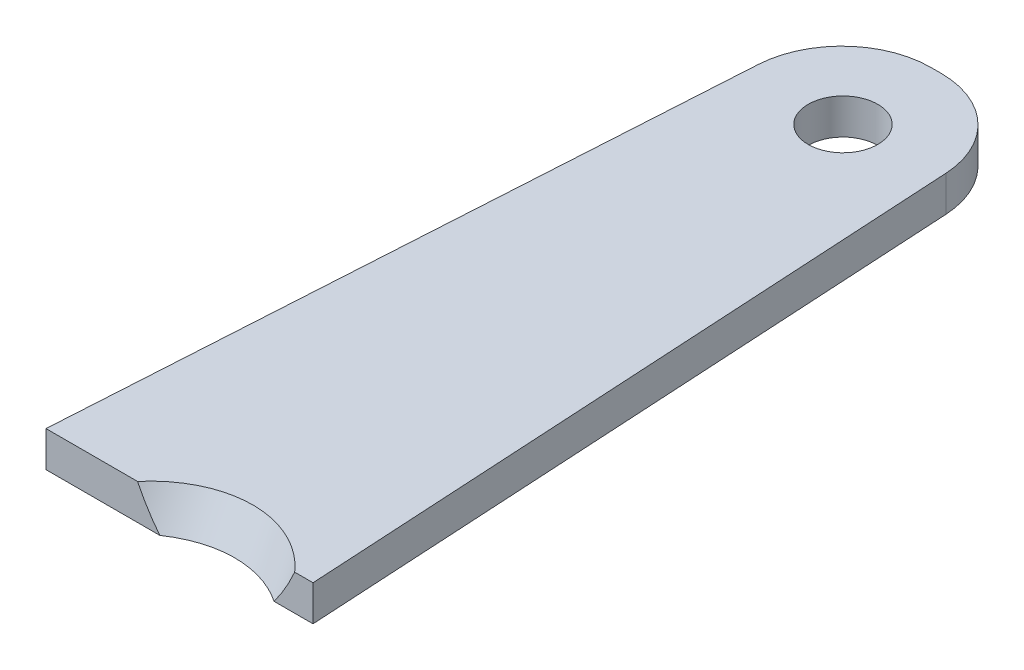
ISO-10303-21;
HEADER;
FILE_DESCRIPTION(('STEP AP214'),'2;1');
FILE_NAME('part.step','',(''),(''),'','','');
FILE_SCHEMA(('AUTOMOTIVE_DESIGN { 1 0 10303 214 1 1 1 1 }'));
ENDSEC;
DATA;
#1=APPLICATION_CONTEXT('core data for automotive mechanical design processes');
#2=APPLICATION_PROTOCOL_DEFINITION('international standard','automotive_design',2000,#1);
#3=PRODUCT_CONTEXT('',#1,'mechanical');
#4=PRODUCT('Part','Part','',(#3));
#5=PRODUCT_RELATED_PRODUCT_CATEGORY('part','',(#4));
#6=PRODUCT_DEFINITION_FORMATION('','',#4);
#7=PRODUCT_DEFINITION_CONTEXT('part definition',#1,'design');
#8=PRODUCT_DEFINITION('design','',#6,#7);
#9=PRODUCT_DEFINITION_SHAPE('','',#8);
#10=(LENGTH_UNIT() NAMED_UNIT(*) SI_UNIT(.MILLI.,.METRE.));
#11=(NAMED_UNIT(*) PLANE_ANGLE_UNIT() SI_UNIT($,.RADIAN.));
#12=(NAMED_UNIT(*) SI_UNIT($,.STERADIAN.) SOLID_ANGLE_UNIT());
#13=UNCERTAINTY_MEASURE_WITH_UNIT(LENGTH_MEASURE(1.E-05),#10,'distance_accuracy_value','');
#14=(GEOMETRIC_REPRESENTATION_CONTEXT(3) GLOBAL_UNCERTAINTY_ASSIGNED_CONTEXT((#13)) GLOBAL_UNIT_ASSIGNED_CONTEXT((#10,
#11,#12)) REPRESENTATION_CONTEXT('',''));
#15=CARTESIAN_POINT('',(0.,0.,0.));
#16=DIRECTION('',(0.,0.,1.));
#17=DIRECTION('',(1.,0.,0.));
#18=AXIS2_PLACEMENT_3D('',#15,#16,#17);
#19=CARTESIAN_POINT('',(15.7255762940305,4.,-74.8434889798303));
#20=DIRECTION('',(0.,-1.,0.));
#21=DIRECTION('',(0.,0.,-1.));
#22=AXIS2_PLACEMENT_3D('',#19,#20,#21);
#23=PLANE('',#22);
#24=CARTESIAN_POINT('',(15.1727945109492,4.,-74.3625495927809));
#25=DIRECTION('',(0.,1.,0.));
#26=DIRECTION('',(0.,0.,1.));
#27=AXIS2_PLACEMENT_3D('',#24,#25,#26);
#28=CIRCLE('',#27,3.91105280336223);
#29=CARTESIAN_POINT('',(15.1727945109492,4.,-70.4514967894187));
#30=VERTEX_POINT('',#29);
#31=EDGE_CURVE('E133',#30,#30,#28,.T.);
#32=ORIENTED_EDGE('',*,*,#31,.F.);
#33=EDGE_LOOP('',(#32));
#34=FACE_BOUND('',#33,.T.);
#35=CARTESIAN_POINT('',(19.2361378723391,4.,9.92641805146242));
#36=DIRECTION('',(0.,-1.,0.));
#37=DIRECTION('',(0.0568035499201906,0.,0.998385374851047));
#38=AXIS2_PLACEMENT_3D('',#35,#36,#37);
#39=ELLIPSE('',#38,14.1222722952671,12.415);
#40=CARTESIAN_POINT('',(27.9389933135625,4.,0.));
#41=VERTEX_POINT('',#40);
#42=CARTESIAN_POINT('',(10.2773268467535,4.,0.));
#43=VERTEX_POINT('',#42);
#44=EDGE_CURVE('E48',#41,#43,#39,.F.);
#45=ORIENTED_EDGE('',*,*,#44,.F.);
#46=DIRECTION('',(1.,0.,0.));
#47=VECTOR('',#46,1.);
#48=CARTESIAN_POINT('',(0.,4.,0.));
#49=LINE('',#48,#47);
#50=CARTESIAN_POINT('',(30.,4.,0.));
#51=VERTEX_POINT('',#50);
#52=EDGE_CURVE('E201',#41,#51,#49,.T.);
#53=ORIENTED_EDGE('',*,*,#52,.T.);
#54=DIRECTION('',(-0.056803549920191,0.,-0.998385374851046));
#55=VECTOR('',#54,1.);
#56=CARTESIAN_POINT('',(25.7094300425409,4.,-75.4115244790321));
#57=LINE('',#56,#55);
#58=CARTESIAN_POINT('',(25.7094300425409,4.,-75.4115244790321));
#59=VERTEX_POINT('',#58);
#60=EDGE_CURVE('E108',#51,#59,#57,.T.);
#61=ORIENTED_EDGE('',*,*,#60,.T.);
#62=CARTESIAN_POINT('',(15.7255762940305,4.,-74.8434889798303));
#63=DIRECTION('',(0.,1.,0.));
#64=DIRECTION('',(0.,0.,-1.));
#65=AXIS2_PLACEMENT_3D('',#62,#63,#64);
#66=CIRCLE('',#65,10.);
#67=CARTESIAN_POINT('',(15.7255762940304,4.,-84.8434889798303));
#68=VERTEX_POINT('',#67);
#69=EDGE_CURVE('E102',#59,#68,#66,.T.);
#70=ORIENTED_EDGE('',*,*,#69,.T.);
#71=DIRECTION('',(-1.,0.,0.));
#72=VECTOR('',#71,1.);
#73=CARTESIAN_POINT('',(15.1727945109492,4.,-84.8434889798303));
#74=LINE('',#73,#72);
#75=CARTESIAN_POINT('',(14.5665722949634,4.,-84.8434889798303));
#76=VERTEX_POINT('',#75);
#77=EDGE_CURVE('E105',#68,#76,#74,.T.);
#78=ORIENTED_EDGE('',*,*,#77,.T.);
#79=CARTESIAN_POINT('',(14.5665722949633,4.,-74.8434889798303));
#80=DIRECTION('',(0.,1.,0.));
#81=DIRECTION('',(0.,0.,1.));
#82=AXIS2_PLACEMENT_3D('',#79,#80,#81);
#83=CIRCLE('',#82,10.);
#84=CARTESIAN_POINT('',(4.58498535615972,4.,-75.4500548732879));
#85=VERTEX_POINT('',#84);
#86=EDGE_CURVE('E57',#76,#85,#83,.T.);
#87=ORIENTED_EDGE('',*,*,#86,.T.);
#88=DIRECTION('',(-0.0606565893457714,0.,0.998158693880356));
#89=VECTOR('',#88,1.);
#90=CARTESIAN_POINT('',(4.58498535615972,4.,-75.4500548732879));
#91=LINE('',#90,#89);
#92=CARTESIAN_POINT('',(0.,4.,0.));
#93=VERTEX_POINT('',#92);
#94=EDGE_CURVE('E143',#85,#93,#91,.T.);
#95=ORIENTED_EDGE('',*,*,#94,.T.);
#96=EDGE_CURVE('E92',#93,#43,#49,.T.);
#97=ORIENTED_EDGE('',*,*,#96,.T.);
#98=EDGE_LOOP('',(#45,#53,#61,#70,#78,#87,#95,#97));
#99=FACE_BOUND('',#98,.T.);
#100=ADVANCED_FACE('F34',(#34,#99),#23,.F.);
#101=CARTESIAN_POINT('',(15.7255762940305,0.,-74.8434889798303));
#102=DIRECTION('',(0.,-1.,0.));
#103=DIRECTION('',(0.,0.,-1.));
#104=AXIS2_PLACEMENT_3D('',#101,#102,#103);
#105=PLANE('',#104);
#106=CARTESIAN_POINT('',(15.1727945109492,0.,-74.3625495927809));
#107=DIRECTION('',(0.,1.,0.));
#108=DIRECTION('',(0.,0.,1.));
#109=AXIS2_PLACEMENT_3D('',#106,#107,#108);
#110=CIRCLE('',#109,3.91105280336223);
#111=CARTESIAN_POINT('',(15.1727945109492,0.,-70.4514967894187));
#112=VERTEX_POINT('',#111);
#113=EDGE_CURVE('E205',#112,#112,#110,.T.);
#114=ORIENTED_EDGE('',*,*,#113,.T.);
#115=EDGE_LOOP('',(#114));
#116=FACE_BOUND('',#115,.T.);
#117=DIRECTION('',(1.,0.,0.));
#118=VECTOR('',#117,1.);
#119=CARTESIAN_POINT('',(0.,0.,0.));
#120=LINE('',#119,#118);
#121=CARTESIAN_POINT('',(25.6133239138531,0.,0.));
#122=VERTEX_POINT('',#121);
#123=CARTESIAN_POINT('',(30.,0.,0.));
#124=VERTEX_POINT('',#123);
#125=EDGE_CURVE('E132',#122,#124,#120,.T.);
#126=ORIENTED_EDGE('',*,*,#125,.F.);
#127=CARTESIAN_POINT('',(19.3593258375993,0.,12.0915831343894));
#128=DIRECTION('',(0.,-1.,0.));
#129=DIRECTION('',(0.0568035499201906,0.,0.998385374851047));
#130=AXIS2_PLACEMENT_3D('',#127,#128,#129);
#131=ELLIPSE('',#130,14.1222722952671,12.415);
#132=CARTESIAN_POINT('',(12.7935427638791,0.,0.));
#133=VERTEX_POINT('',#132);
#134=EDGE_CURVE('E156',#122,#133,#131,.F.);
#135=ORIENTED_EDGE('',*,*,#134,.T.);
#136=CARTESIAN_POINT('',(0.,0.,0.));
#137=VERTEX_POINT('',#136);
#138=EDGE_CURVE('E134',#137,#133,#120,.T.);
#139=ORIENTED_EDGE('',*,*,#138,.F.);
#140=DIRECTION('',(-0.0606565893457714,0.,0.998158693880356));
#141=VECTOR('',#140,1.);
#142=CARTESIAN_POINT('',(4.58498535615972,0.,-75.4500548732879));
#143=LINE('',#142,#141);
#144=CARTESIAN_POINT('',(4.58498535615972,0.,-75.4500548732879));
#145=VERTEX_POINT('',#144);
#146=EDGE_CURVE('E129',#145,#137,#143,.T.);
#147=ORIENTED_EDGE('',*,*,#146,.F.);
#148=CARTESIAN_POINT('',(14.5665722949633,0.,-74.8434889798303));
#149=DIRECTION('',(0.,1.,0.));
#150=DIRECTION('',(0.,0.,1.));
#151=AXIS2_PLACEMENT_3D('',#148,#149,#150);
#152=CIRCLE('',#151,10.);
#153=CARTESIAN_POINT('',(14.5665722949634,0.,-84.8434889798303));
#154=VERTEX_POINT('',#153);
#155=EDGE_CURVE('E84',#154,#145,#152,.T.);
#156=ORIENTED_EDGE('',*,*,#155,.F.);
#157=DIRECTION('',(-1.,0.,0.));
#158=VECTOR('',#157,1.);
#159=CARTESIAN_POINT('',(15.1727945109492,0.,-84.8434889798303));
#160=LINE('',#159,#158);
#161=CARTESIAN_POINT('',(15.7255762940304,0.,-84.8434889798303));
#162=VERTEX_POINT('',#161);
#163=EDGE_CURVE('E140',#162,#154,#160,.T.);
#164=ORIENTED_EDGE('',*,*,#163,.F.);
#165=CARTESIAN_POINT('',(15.7255762940305,0.,-74.8434889798303));
#166=DIRECTION('',(0.,1.,0.));
#167=DIRECTION('',(0.,0.,-1.));
#168=AXIS2_PLACEMENT_3D('',#165,#166,#167);
#169=CIRCLE('',#168,10.);
#170=CARTESIAN_POINT('',(25.7094300425409,0.,-75.4115244790321));
#171=VERTEX_POINT('',#170);
#172=EDGE_CURVE('E118',#171,#162,#169,.T.);
#173=ORIENTED_EDGE('',*,*,#172,.F.);
#174=DIRECTION('',(-0.056803549920191,0.,-0.998385374851046));
#175=VECTOR('',#174,1.);
#176=CARTESIAN_POINT('',(25.7094300425409,0.,-75.4115244790321));
#177=LINE('',#176,#175);
#178=EDGE_CURVE('E137',#124,#171,#177,.T.);
#179=ORIENTED_EDGE('',*,*,#178,.F.);
#180=EDGE_LOOP('',(#126,#135,#139,#147,#156,#164,#173,#179));
#181=FACE_BOUND('',#180,.T.);
#182=ADVANCED_FACE('F161',(#116,#181),#105,.T.);
#183=CARTESIAN_POINT('',(0.,4.,0.));
#184=DIRECTION('',(0.,0.,-1.));
#185=DIRECTION('',(-1.,0.,0.));
#186=AXIS2_PLACEMENT_3D('',#183,#184,#185);
#187=PLANE('',#186);
#188=CARTESIAN_POINT('',(18.6713702009386,22.3384040870333,0.));
#189=DIRECTION('',(0.,0.,-1.));
#190=DIRECTION('',(0.0307823969206546,-0.999526109733918,0.));
#191=AXIS2_PLACEMENT_3D('',#188,#189,#190);
#192=ELLIPSE('',#191,26.0899686709817,12.415);
#193=EDGE_CURVE('E11',#122,#41,#192,.F.);
#194=ORIENTED_EDGE('',*,*,#193,.F.);
#195=ORIENTED_EDGE('',*,*,#125,.T.);
#196=DIRECTION('',(0.,-1.,0.));
#197=VECTOR('',#196,1.);
#198=CARTESIAN_POINT('',(30.,4.,0.));
#199=LINE('',#198,#197);
#200=EDGE_CURVE('E147',#51,#124,#199,.T.);
#201=ORIENTED_EDGE('',*,*,#200,.F.);
#202=ORIENTED_EDGE('',*,*,#52,.F.);
#203=EDGE_LOOP('',(#194,#195,#201,#202));
#204=FACE_BOUND('',#203,.T.);
#205=ADVANCED_FACE('F167',(#204),#187,.F.);
#206=EDGE_CURVE('E38',#43,#133,#192,.F.);
#207=ORIENTED_EDGE('',*,*,#206,.F.);
#208=ORIENTED_EDGE('',*,*,#96,.F.);
#209=DIRECTION('',(0.,-1.,0.));
#210=VECTOR('',#209,1.);
#211=CARTESIAN_POINT('',(0.,4.,0.));
#212=LINE('',#211,#210);
#213=EDGE_CURVE('E149',#93,#137,#212,.T.);
#214=ORIENTED_EDGE('',*,*,#213,.T.);
#215=ORIENTED_EDGE('',*,*,#138,.T.);
#216=EDGE_LOOP('',(#207,#208,#214,#215));
#217=FACE_BOUND('',#216,.T.);
#218=ADVANCED_FACE('F165',(#217),#187,.F.);
#219=CARTESIAN_POINT('',(4.58498535615972,4.,-75.4500548732879));
#220=DIRECTION('',(0.998158693880356,0.,0.0606565893457715));
#221=DIRECTION('',(0.0606565893457715,0.,-0.998158693880356));
#222=AXIS2_PLACEMENT_3D('',#219,#220,#221);
#223=PLANE('',#222);
#224=ORIENTED_EDGE('',*,*,#146,.T.);
#225=ORIENTED_EDGE('',*,*,#213,.F.);
#226=ORIENTED_EDGE('',*,*,#94,.F.);
#227=DIRECTION('',(0.,-1.,0.));
#228=VECTOR('',#227,1.);
#229=CARTESIAN_POINT('',(4.58498535615972,4.,-75.4500548732879));
#230=LINE('',#229,#228);
#231=EDGE_CURVE('E125',#85,#145,#230,.T.);
#232=ORIENTED_EDGE('',*,*,#231,.T.);
#233=EDGE_LOOP('',(#224,#225,#226,#232));
#234=FACE_BOUND('',#233,.T.);
#235=ADVANCED_FACE('F36',(#234),#223,.F.);
#236=CARTESIAN_POINT('',(25.7094300425409,4.,-75.4115244790321));
#237=DIRECTION('',(-0.998385374851046,0.,0.056803549920191));
#238=DIRECTION('',(0.056803549920191,0.,0.998385374851047));
#239=AXIS2_PLACEMENT_3D('',#236,#237,#238);
#240=PLANE('',#239);
#241=ORIENTED_EDGE('',*,*,#178,.T.);
#242=DIRECTION('',(0.,-1.,0.));
#243=VECTOR('',#242,1.);
#244=CARTESIAN_POINT('',(25.7094300425409,4.,-75.4115244790321));
#245=LINE('',#244,#243);
#246=EDGE_CURVE('E120',#59,#171,#245,.T.);
#247=ORIENTED_EDGE('',*,*,#246,.F.);
#248=ORIENTED_EDGE('',*,*,#60,.F.);
#249=ORIENTED_EDGE('',*,*,#200,.T.);
#250=EDGE_LOOP('',(#241,#247,#248,#249));
#251=FACE_BOUND('',#250,.T.);
#252=ADVANCED_FACE('F172',(#251),#240,.F.);
#253=CARTESIAN_POINT('',(15.7255762940305,4.,-74.8434889798303));
#254=DIRECTION('',(0.,-1.,0.));
#255=DIRECTION('',(0.,0.,-1.));
#256=AXIS2_PLACEMENT_3D('',#253,#254,#255);
#257=CYLINDRICAL_SURFACE('',#256,10.);
#258=ORIENTED_EDGE('',*,*,#172,.T.);
#259=DIRECTION('',(0.,-1.,0.));
#260=VECTOR('',#259,1.);
#261=CARTESIAN_POINT('',(15.7255762940304,4.,-84.8434889798303));
#262=LINE('',#261,#260);
#263=EDGE_CURVE('E115',#68,#162,#262,.T.);
#264=ORIENTED_EDGE('',*,*,#263,.F.);
#265=ORIENTED_EDGE('',*,*,#69,.F.);
#266=ORIENTED_EDGE('',*,*,#246,.T.);
#267=EDGE_LOOP('',(#258,#264,#265,#266));
#268=FACE_BOUND('',#267,.T.);
#269=ADVANCED_FACE('F116',(#268),#257,.T.);
#270=CARTESIAN_POINT('',(15.1727945109492,4.,-84.8434889798303));
#271=DIRECTION('',(0.,0.,1.));
#272=DIRECTION('',(1.,0.,0.));
#273=AXIS2_PLACEMENT_3D('',#270,#271,#272);
#274=PLANE('',#273);
#275=ORIENTED_EDGE('',*,*,#163,.T.);
#276=DIRECTION('',(0.,-1.,0.));
#277=VECTOR('',#276,1.);
#278=CARTESIAN_POINT('',(14.5665722949634,4.,-84.8434889798303));
#279=LINE('',#278,#277);
#280=EDGE_CURVE('E121',#76,#154,#279,.T.);
#281=ORIENTED_EDGE('',*,*,#280,.F.);
#282=ORIENTED_EDGE('',*,*,#77,.F.);
#283=ORIENTED_EDGE('',*,*,#263,.T.);
#284=EDGE_LOOP('',(#275,#281,#282,#283));
#285=FACE_BOUND('',#284,.T.);
#286=ADVANCED_FACE('F123',(#285),#274,.F.);
#287=CARTESIAN_POINT('',(14.5665722949633,4.,-74.8434889798303));
#288=DIRECTION('',(0.,-1.,0.));
#289=DIRECTION('',(0.,0.,-1.));
#290=AXIS2_PLACEMENT_3D('',#287,#288,#289);
#291=CYLINDRICAL_SURFACE('',#290,10.);
#292=ORIENTED_EDGE('',*,*,#155,.T.);
#293=ORIENTED_EDGE('',*,*,#231,.F.);
#294=ORIENTED_EDGE('',*,*,#86,.F.);
#295=ORIENTED_EDGE('',*,*,#280,.T.);
#296=EDGE_LOOP('',(#292,#293,#294,#295));
#297=FACE_BOUND('',#296,.T.);
#298=ADVANCED_FACE('F189',(#297),#291,.T.);
#299=CARTESIAN_POINT('',(15.1727945109492,4.,-74.3625495927809));
#300=DIRECTION('',(0.,-1.,0.));
#301=DIRECTION('',(0.,0.,-1.));
#302=AXIS2_PLACEMENT_3D('',#299,#300,#301);
#303=CYLINDRICAL_SURFACE('',#302,3.91105280336223);
#304=ORIENTED_EDGE('',*,*,#31,.T.);
#305=EDGE_LOOP('',(#304));
#306=FACE_BOUND('',#305,.T.);
#307=ORIENTED_EDGE('',*,*,#113,.F.);
#308=EDGE_LOOP('',(#307));
#309=FACE_BOUND('',#308,.T.);
#310=ADVANCED_FACE('F186',(#306,#309),#303,.F.);
#311=CARTESIAN_POINT('',(18.2368733682036,36.4468222857458,-7.63676361479598));
#312=DIRECTION('',(0.02707387587369,-0.879107819225435,0.475853388578747));
#313=DIRECTION('',(0.0499364448945949,0.476622955990057,0.877688389631872));
#314=AXIS2_PLACEMENT_3D('',#311,#312,#313);
#315=CYLINDRICAL_SURFACE('',#314,12.415);
#316=ORIENTED_EDGE('',*,*,#193,.T.);
#317=ORIENTED_EDGE('',*,*,#44,.T.);
#318=ORIENTED_EDGE('',*,*,#206,.T.);
#319=ORIENTED_EDGE('',*,*,#134,.F.);
#320=EDGE_LOOP('',(#316,#317,#318,#319));
#321=FACE_BOUND('',#320,.T.);
#322=ADVANCED_FACE('F154',(#321),#315,.F.);
#323=CLOSED_SHELL('',(#100,#182,#205,#218,#235,#252,#269,#286,#298,#310,#322));
#324=MANIFOLD_SOLID_BREP('B2',#323);
#325=ADVANCED_BREP_SHAPE_REPRESENTATION('',(#18,#324),#14);
#326=SHAPE_DEFINITION_REPRESENTATION(#9,#325);
ENDSEC;
END-ISO-10303-21;
